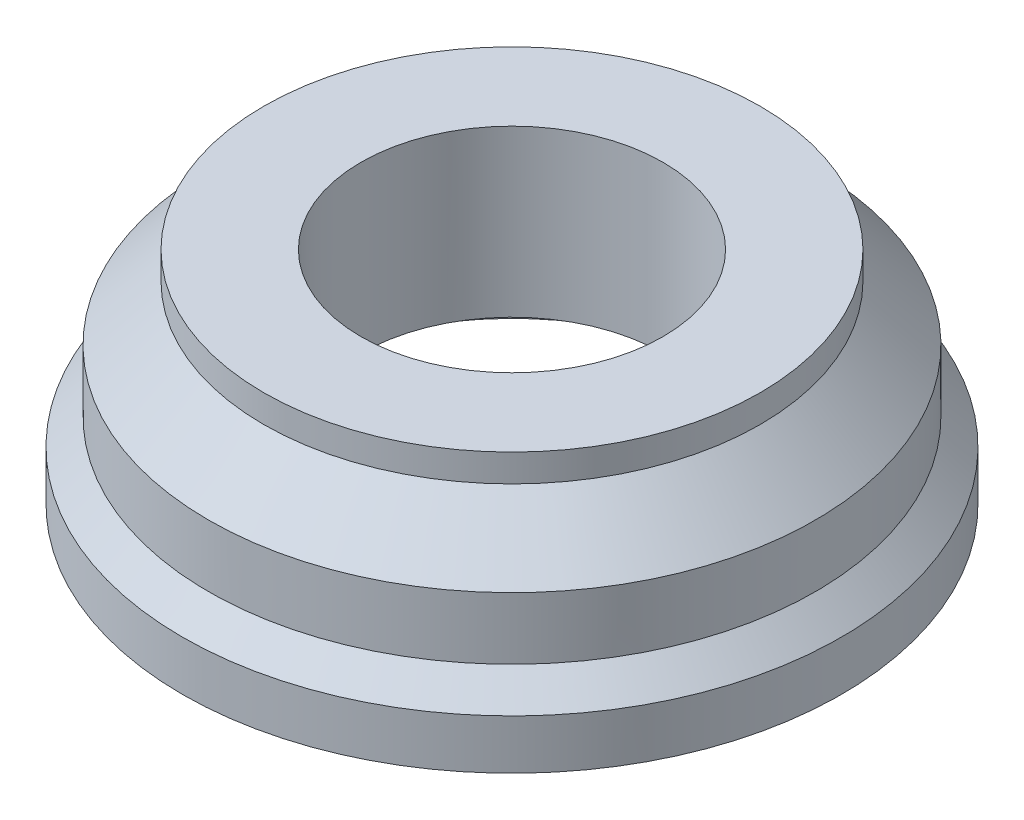
ISO-10303-21;
HEADER;
FILE_DESCRIPTION(('STEP AP214'),'2;1');
FILE_NAME('part.step','',(''),(''),'','','');
FILE_SCHEMA(('AUTOMOTIVE_DESIGN { 1 0 10303 214 1 1 1 1 }'));
ENDSEC;
DATA;
#1=APPLICATION_CONTEXT('core data for automotive mechanical design processes');
#2=APPLICATION_PROTOCOL_DEFINITION('international standard','automotive_design',2000,#1);
#3=PRODUCT_CONTEXT('',#1,'mechanical');
#4=PRODUCT('Part','Part','',(#3));
#5=PRODUCT_RELATED_PRODUCT_CATEGORY('part','',(#4));
#6=PRODUCT_DEFINITION_FORMATION('','',#4);
#7=PRODUCT_DEFINITION_CONTEXT('part definition',#1,'design');
#8=PRODUCT_DEFINITION('design','',#6,#7);
#9=PRODUCT_DEFINITION_SHAPE('','',#8);
#10=(LENGTH_UNIT() NAMED_UNIT(*) SI_UNIT(.MILLI.,.METRE.));
#11=(NAMED_UNIT(*) PLANE_ANGLE_UNIT() SI_UNIT($,.RADIAN.));
#12=(NAMED_UNIT(*) SI_UNIT($,.STERADIAN.) SOLID_ANGLE_UNIT());
#13=UNCERTAINTY_MEASURE_WITH_UNIT(LENGTH_MEASURE(1.E-05),#10,'distance_accuracy_value','');
#14=(GEOMETRIC_REPRESENTATION_CONTEXT(3) GLOBAL_UNCERTAINTY_ASSIGNED_CONTEXT((#13)) GLOBAL_UNIT_ASSIGNED_CONTEXT((#10,
#11,#12)) REPRESENTATION_CONTEXT('',''));
#15=CARTESIAN_POINT('',(0.,0.,0.));
#16=DIRECTION('',(0.,0.,1.));
#17=DIRECTION('',(1.,0.,0.));
#18=AXIS2_PLACEMENT_3D('',#15,#16,#17);
#19=CARTESIAN_POINT('',(-48.017326928212,8.,-15.2314527177294));
#20=DIRECTION('',(0.,-1.,0.));
#21=DIRECTION('',(0.,0.,-1.));
#22=AXIS2_PLACEMENT_3D('',#19,#20,#21);
#23=CYLINDRICAL_SURFACE('',#22,5.47733333333481);
#24=CARTESIAN_POINT('',(-48.017326928212,8.,-15.2314527177294));
#25=DIRECTION('',(0.,1.,0.));
#26=DIRECTION('',(0.,0.,1.));
#27=AXIS2_PLACEMENT_3D('',#24,#25,#26);
#28=CIRCLE('',#27,5.47733333333481);
#29=CARTESIAN_POINT('',(-48.017326928212,8.,-9.75411938439455));
#30=VERTEX_POINT('',#29);
#31=EDGE_CURVE('E57',#30,#30,#28,.T.);
#32=ORIENTED_EDGE('',*,*,#31,.T.);
#33=EDGE_LOOP('',(#32));
#34=FACE_BOUND('',#33,.T.);
#35=CARTESIAN_POINT('',(-48.017326928212,2.,-15.2314527177294));
#36=DIRECTION('',(0.,-1.,0.));
#37=DIRECTION('',(0.,0.,-1.));
#38=AXIS2_PLACEMENT_3D('',#35,#36,#37);
#39=CIRCLE('',#38,5.47733333333481);
#40=CARTESIAN_POINT('',(-48.017326928212,2.,-20.7087860510642));
#41=VERTEX_POINT('',#40);
#42=EDGE_CURVE('E50',#41,#41,#39,.T.);
#43=ORIENTED_EDGE('',*,*,#42,.T.);
#44=EDGE_LOOP('',(#43));
#45=FACE_BOUND('',#44,.T.);
#46=ADVANCED_FACE('F32',(#34,#45),#23,.F.);
#47=CARTESIAN_POINT('',(-48.017326928212,8.,-15.2314527177294));
#48=DIRECTION('',(0.,-1.,0.));
#49=DIRECTION('',(0.,0.,-1.));
#50=AXIS2_PLACEMENT_3D('',#47,#48,#49);
#51=CYLINDRICAL_SURFACE('',#50,9.00000000000196);
#52=CARTESIAN_POINT('',(-48.017326928212,7.,-15.2314527177294));
#53=DIRECTION('',(0.,1.,0.));
#54=DIRECTION('',(0.,0.,1.));
#55=AXIS2_PLACEMENT_3D('',#52,#53,#54);
#56=CIRCLE('',#55,9.00000000000196);
#57=CARTESIAN_POINT('',(-48.017326928212,7.,-6.23145271772739));
#58=VERTEX_POINT('',#57);
#59=EDGE_CURVE('E53',#58,#58,#56,.T.);
#60=ORIENTED_EDGE('',*,*,#59,.T.);
#61=EDGE_LOOP('',(#60));
#62=FACE_BOUND('',#61,.T.);
#63=CARTESIAN_POINT('',(-48.017326928212,8.,-15.2314527177294));
#64=DIRECTION('',(0.,1.,0.));
#65=DIRECTION('',(0.,0.,1.));
#66=AXIS2_PLACEMENT_3D('',#63,#64,#65);
#67=CIRCLE('',#66,9.00000000000196);
#68=CARTESIAN_POINT('',(-48.017326928212,8.,-6.23145271772739));
#69=VERTEX_POINT('',#68);
#70=EDGE_CURVE('E47',#69,#69,#67,.T.);
#71=ORIENTED_EDGE('',*,*,#70,.F.);
#72=EDGE_LOOP('',(#71));
#73=FACE_BOUND('',#72,.T.);
#74=ADVANCED_FACE('F94',(#62,#73),#51,.T.);
#75=CARTESIAN_POINT('',(0.,8.,0.));
#76=DIRECTION('',(0.,1.,0.));
#77=DIRECTION('',(0.,0.,1.));
#78=AXIS2_PLACEMENT_3D('',#75,#76,#77);
#79=PLANE('',#78);
#80=ORIENTED_EDGE('',*,*,#31,.F.);
#81=EDGE_LOOP('',(#80));
#82=FACE_BOUND('',#81,.T.);
#83=ORIENTED_EDGE('',*,*,#70,.T.);
#84=EDGE_LOOP('',(#83));
#85=FACE_BOUND('',#84,.T.);
#86=ADVANCED_FACE('F91',(#82,#85),#79,.T.);
#87=CARTESIAN_POINT('',(-48.017326928212,7.,-15.2314527177294));
#88=DIRECTION('',(0.,-1.,0.));
#89=DIRECTION('',(0.,0.,-1.));
#90=AXIS2_PLACEMENT_3D('',#87,#88,#89);
#91=CYLINDRICAL_SURFACE('',#90,11.000000000002);
#92=CARTESIAN_POINT('',(-48.017326928212,4.99999999999999,-15.2314527177294));
#93=DIRECTION('',(0.,1.,0.));
#94=DIRECTION('',(0.,0.,1.));
#95=AXIS2_PLACEMENT_3D('',#92,#93,#94);
#96=CIRCLE('',#95,11.000000000002);
#97=CARTESIAN_POINT('',(-48.017326928212,4.99999999999999,-4.23145271772739));
#98=VERTEX_POINT('',#97);
#99=EDGE_CURVE('E10',#98,#98,#96,.F.);
#100=ORIENTED_EDGE('',*,*,#99,.T.);
#101=EDGE_LOOP('',(#100));
#102=FACE_BOUND('',#101,.T.);
#103=CARTESIAN_POINT('',(-48.017326928212,2.75000000000002,-15.2314527177294));
#104=DIRECTION('',(0.,-1.,0.));
#105=DIRECTION('',(0.,0.,-1.));
#106=AXIS2_PLACEMENT_3D('',#103,#104,#105);
#107=CIRCLE('',#106,11.000000000002);
#108=CARTESIAN_POINT('',(-48.017326928212,2.75000000000002,-26.2314527177313));
#109=VERTEX_POINT('',#108);
#110=EDGE_CURVE('E39',#109,#109,#107,.F.);
#111=ORIENTED_EDGE('',*,*,#110,.T.);
#112=EDGE_LOOP('',(#111));
#113=FACE_BOUND('',#112,.T.);
#114=ADVANCED_FACE('F82',(#102,#113),#91,.T.);
#115=CARTESIAN_POINT('',(-48.017326928212,3.,-15.2314527177294));
#116=DIRECTION('',(0.,-1.,0.));
#117=DIRECTION('',(0.,0.,-1.));
#118=AXIS2_PLACEMENT_3D('',#115,#116,#117);
#119=CYLINDRICAL_SURFACE('',#118,11.950000000002);
#120=CARTESIAN_POINT('',(-48.017326928212,1.79999999999999,-15.2314527177294));
#121=DIRECTION('',(0.,1.,0.));
#122=DIRECTION('',(0.,0.,1.));
#123=AXIS2_PLACEMENT_3D('',#120,#121,#122);
#124=CIRCLE('',#123,11.950000000002);
#125=CARTESIAN_POINT('',(-48.017326928212,1.79999999999999,-3.28145271772735));
#126=VERTEX_POINT('',#125);
#127=EDGE_CURVE('E43',#126,#126,#124,.F.);
#128=ORIENTED_EDGE('',*,*,#127,.T.);
#129=EDGE_LOOP('',(#128));
#130=FACE_BOUND('',#129,.T.);
#131=CARTESIAN_POINT('',(-48.017326928212,0.,-15.2314527177294));
#132=DIRECTION('',(0.,1.,0.));
#133=DIRECTION('',(0.,0.,1.));
#134=AXIS2_PLACEMENT_3D('',#131,#132,#133);
#135=CIRCLE('',#134,11.950000000002);
#136=CARTESIAN_POINT('',(-48.017326928212,0.,-3.28145271772735));
#137=VERTEX_POINT('',#136);
#138=EDGE_CURVE('E64',#137,#137,#135,.T.);
#139=ORIENTED_EDGE('',*,*,#138,.T.);
#140=EDGE_LOOP('',(#139));
#141=FACE_BOUND('',#140,.T.);
#142=ADVANCED_FACE('F80',(#130,#141),#119,.T.);
#143=CARTESIAN_POINT('',(-48.017326928212,2.,-15.2314527177294));
#144=DIRECTION('',(0.,-1.,0.));
#145=DIRECTION('',(0.,0.,-1.));
#146=AXIS2_PLACEMENT_3D('',#143,#144,#145);
#147=CYLINDRICAL_SURFACE('',#146,8.25);
#148=CARTESIAN_POINT('',(-48.017326928212,0.,-15.2314527177294));
#149=DIRECTION('',(0.,1.,0.));
#150=DIRECTION('',(0.,0.,1.));
#151=AXIS2_PLACEMENT_3D('',#148,#149,#150);
#152=CIRCLE('',#151,8.25);
#153=CARTESIAN_POINT('',(-48.017326928212,0.,-6.98145271772936));
#154=VERTEX_POINT('',#153);
#155=EDGE_CURVE('E67',#154,#154,#152,.F.);
#156=ORIENTED_EDGE('',*,*,#155,.T.);
#157=EDGE_LOOP('',(#156));
#158=FACE_BOUND('',#157,.T.);
#159=CARTESIAN_POINT('',(-48.017326928212,2.,-15.2314527177294));
#160=DIRECTION('',(0.,-1.,0.));
#161=DIRECTION('',(0.,0.,-1.));
#162=AXIS2_PLACEMENT_3D('',#159,#160,#161);
#163=CIRCLE('',#162,8.25);
#164=CARTESIAN_POINT('',(-48.017326928212,2.,-23.4814527177294));
#165=VERTEX_POINT('',#164);
#166=EDGE_CURVE('E54',#165,#165,#163,.T.);
#167=ORIENTED_EDGE('',*,*,#166,.F.);
#168=EDGE_LOOP('',(#167));
#169=FACE_BOUND('',#168,.T.);
#170=ADVANCED_FACE('F71',(#158,#169),#147,.F.);
#171=CARTESIAN_POINT('',(-48.017326928212,2.,-15.2314527177294));
#172=DIRECTION('',(0.,-1.,0.));
#173=DIRECTION('',(0.,0.,-1.));
#174=AXIS2_PLACEMENT_3D('',#171,#172,#173);
#175=PLANE('',#174);
#176=ORIENTED_EDGE('',*,*,#42,.F.);
#177=EDGE_LOOP('',(#176));
#178=FACE_BOUND('',#177,.T.);
#179=ORIENTED_EDGE('',*,*,#166,.T.);
#180=EDGE_LOOP('',(#179));
#181=FACE_BOUND('',#180,.T.);
#182=ADVANCED_FACE('F89',(#178,#181),#175,.T.);
#183=CARTESIAN_POINT('',(-48.017326928212,3.,-15.2314527177294));
#184=DIRECTION('',(0.,-1.,0.));
#185=DIRECTION('',(0.,0.,-1.));
#186=AXIS2_PLACEMENT_3D('',#183,#184,#185);
#187=CONICAL_SURFACE('',#186,10.750000000002,0.785398163397453);
#188=ORIENTED_EDGE('',*,*,#127,.F.);
#189=EDGE_LOOP('',(#188));
#190=FACE_BOUND('',#189,.T.);
#191=ORIENTED_EDGE('',*,*,#110,.F.);
#192=EDGE_LOOP('',(#191));
#193=FACE_BOUND('',#192,.T.);
#194=ADVANCED_FACE('F104',(#190,#193),#187,.T.);
#195=CARTESIAN_POINT('',(-48.017326928212,7.,-15.2314527177294));
#196=DIRECTION('',(0.,-1.,0.));
#197=DIRECTION('',(0.,0.,-1.));
#198=AXIS2_PLACEMENT_3D('',#195,#196,#197);
#199=CONICAL_SURFACE('',#198,9.00000000000196,0.785398163397446);
#200=ORIENTED_EDGE('',*,*,#99,.F.);
#201=EDGE_LOOP('',(#200));
#202=FACE_BOUND('',#201,.T.);
#203=ORIENTED_EDGE('',*,*,#59,.F.);
#204=EDGE_LOOP('',(#203));
#205=FACE_BOUND('',#204,.T.);
#206=ADVANCED_FACE('F34',(#202,#205),#199,.T.);
#207=CARTESIAN_POINT('',(-63.1303196253909,0.,1.7685472822702));
#208=DIRECTION('',(0.,1.,0.));
#209=DIRECTION('',(0.,0.,1.));
#210=AXIS2_PLACEMENT_3D('',#207,#208,#209);
#211=PLANE('',#210);
#212=ORIENTED_EDGE('',*,*,#155,.F.);
#213=EDGE_LOOP('',(#212));
#214=FACE_BOUND('',#213,.T.);
#215=ORIENTED_EDGE('',*,*,#138,.F.);
#216=EDGE_LOOP('',(#215));
#217=FACE_BOUND('',#216,.T.);
#218=ADVANCED_FACE('F74',(#214,#217),#211,.F.);
#219=CLOSED_SHELL('',(#46,#74,#86,#114,#142,#170,#182,#194,#206,#218));
#220=MANIFOLD_SOLID_BREP('B2',#219);
#221=ADVANCED_BREP_SHAPE_REPRESENTATION('',(#18,#220),#14);
#222=SHAPE_DEFINITION_REPRESENTATION(#9,#221);
ENDSEC;
END-ISO-10303-21;
